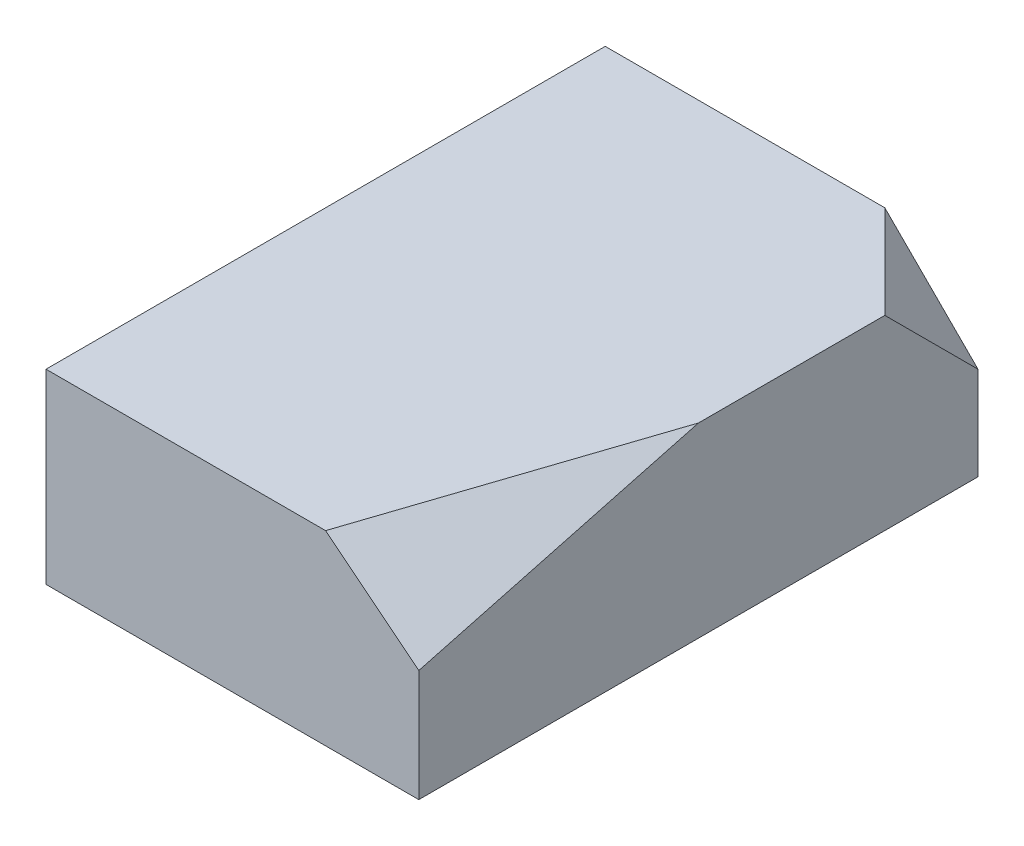
ISO-10303-21;
HEADER;
FILE_DESCRIPTION(('STEP AP214'),'2;1');
FILE_NAME('part.step','',(''),(''),'','','');
FILE_SCHEMA(('AUTOMOTIVE_DESIGN { 1 0 10303 214 1 1 1 1 }'));
ENDSEC;
DATA;
#1=APPLICATION_CONTEXT('core data for automotive mechanical design processes');
#2=APPLICATION_PROTOCOL_DEFINITION('international standard','automotive_design',2000,#1);
#3=PRODUCT_CONTEXT('',#1,'mechanical');
#4=PRODUCT('Part','Part','',(#3));
#5=PRODUCT_RELATED_PRODUCT_CATEGORY('part','',(#4));
#6=PRODUCT_DEFINITION_FORMATION('','',#4);
#7=PRODUCT_DEFINITION_CONTEXT('part definition',#1,'design');
#8=PRODUCT_DEFINITION('design','',#6,#7);
#9=PRODUCT_DEFINITION_SHAPE('','',#8);
#10=(LENGTH_UNIT() NAMED_UNIT(*) SI_UNIT(.MILLI.,.METRE.));
#11=(NAMED_UNIT(*) PLANE_ANGLE_UNIT() SI_UNIT($,.RADIAN.));
#12=(NAMED_UNIT(*) SI_UNIT($,.STERADIAN.) SOLID_ANGLE_UNIT());
#13=UNCERTAINTY_MEASURE_WITH_UNIT(LENGTH_MEASURE(1.E-05),#10,'distance_accuracy_value','');
#14=(GEOMETRIC_REPRESENTATION_CONTEXT(3) GLOBAL_UNCERTAINTY_ASSIGNED_CONTEXT((#13)) GLOBAL_UNIT_ASSIGNED_CONTEXT((#10,
#11,#12)) REPRESENTATION_CONTEXT('',''));
#15=CARTESIAN_POINT('',(0.,0.,0.));
#16=DIRECTION('',(0.,0.,1.));
#17=DIRECTION('',(1.,0.,0.));
#18=AXIS2_PLACEMENT_3D('',#15,#16,#17);
#19=CARTESIAN_POINT('',(50.8,50.8,76.2));
#20=DIRECTION('',(-1.,0.,0.));
#21=DIRECTION('',(0.,0.,1.));
#22=AXIS2_PLACEMENT_3D('',#19,#20,#21);
#23=PLANE('',#22);
#24=DIRECTION('',(0.,0.707106781186547,0.707106781186548));
#25=VECTOR('',#24,1.);
#26=CARTESIAN_POINT('',(50.8,50.8,-50.8));
#27=LINE('',#26,#25);
#28=CARTESIAN_POINT('',(50.7999999999999,25.4,-76.2));
#29=VERTEX_POINT('',#28);
#30=CARTESIAN_POINT('',(50.8,50.8,-50.8));
#31=VERTEX_POINT('',#30);
#32=EDGE_CURVE('E54',#29,#31,#27,.T.);
#33=ORIENTED_EDGE('',*,*,#32,.T.);
#34=DIRECTION('',(0.,0.,-1.));
#35=VECTOR('',#34,1.);
#36=CARTESIAN_POINT('',(50.8,50.8,76.2));
#37=LINE('',#36,#35);
#38=CARTESIAN_POINT('',(50.8,50.8,-1.45716771982052E-13));
#39=VERTEX_POINT('',#38);
#40=EDGE_CURVE('E103',#39,#31,#37,.T.);
#41=ORIENTED_EDGE('',*,*,#40,.F.);
#42=DIRECTION('',(0.,0.257662650560332,-0.966234939601246));
#43=VECTOR('',#42,1.);
#44=CARTESIAN_POINT('',(50.7999999999999,50.8,0.));
#45=LINE('',#44,#43);
#46=CARTESIAN_POINT('',(50.7999999999999,30.48,76.2));
#47=VERTEX_POINT('',#46);
#48=EDGE_CURVE('E62',#47,#39,#45,.T.);
#49=ORIENTED_EDGE('',*,*,#48,.F.);
#50=DIRECTION('',(0.,-1.,0.));
#51=VECTOR('',#50,1.);
#52=CARTESIAN_POINT('',(50.8,50.8,76.2));
#53=LINE('',#52,#51);
#54=CARTESIAN_POINT('',(50.8,0.,76.2));
#55=VERTEX_POINT('',#54);
#56=EDGE_CURVE('E123',#47,#55,#53,.T.);
#57=ORIENTED_EDGE('',*,*,#56,.T.);
#58=DIRECTION('',(0.,0.,-1.));
#59=VECTOR('',#58,1.);
#60=CARTESIAN_POINT('',(50.8,0.,76.2));
#61=LINE('',#60,#59);
#62=CARTESIAN_POINT('',(50.8,0.,-76.2));
#63=VERTEX_POINT('',#62);
#64=EDGE_CURVE('E124',#55,#63,#61,.T.);
#65=ORIENTED_EDGE('',*,*,#64,.T.);
#66=DIRECTION('',(0.,-1.,0.));
#67=VECTOR('',#66,1.);
#68=CARTESIAN_POINT('',(50.8,50.8,-76.2));
#69=LINE('',#68,#67);
#70=EDGE_CURVE('E11',#29,#63,#69,.T.);
#71=ORIENTED_EDGE('',*,*,#70,.F.);
#72=EDGE_LOOP('',(#33,#41,#49,#57,#65,#71));
#73=FACE_BOUND('',#72,.T.);
#74=ADVANCED_FACE('F39',(#73),#23,.F.);
#75=CARTESIAN_POINT('',(0.,50.8,0.));
#76=DIRECTION('',(0.,-1.,0.));
#77=DIRECTION('',(0.,0.,-1.));
#78=AXIS2_PLACEMENT_3D('',#75,#76,#77);
#79=PLANE('',#78);
#80=DIRECTION('',(-0.707106781186548,0.,-0.707106781186547));
#81=VECTOR('',#80,1.);
#82=CARTESIAN_POINT('',(25.3999999999999,50.8,-76.2));
#83=LINE('',#82,#81);
#84=CARTESIAN_POINT('',(25.3999999999999,50.8,-76.2));
#85=VERTEX_POINT('',#84);
#86=EDGE_CURVE('E91',#31,#85,#83,.T.);
#87=ORIENTED_EDGE('',*,*,#86,.T.);
#88=DIRECTION('',(-1.,0.,0.));
#89=VECTOR('',#88,1.);
#90=CARTESIAN_POINT('',(-50.8,50.8,-76.2));
#91=LINE('',#90,#89);
#92=CARTESIAN_POINT('',(-50.8,50.8,-76.2));
#93=VERTEX_POINT('',#92);
#94=EDGE_CURVE('E100',#85,#93,#91,.T.);
#95=ORIENTED_EDGE('',*,*,#94,.T.);
#96=DIRECTION('',(0.,0.,1.));
#97=VECTOR('',#96,1.);
#98=CARTESIAN_POINT('',(-50.8,50.8,76.2));
#99=LINE('',#98,#97);
#100=CARTESIAN_POINT('',(-50.8,50.8,76.2));
#101=VERTEX_POINT('',#100);
#102=EDGE_CURVE('E110',#93,#101,#99,.T.);
#103=ORIENTED_EDGE('',*,*,#102,.T.);
#104=DIRECTION('',(1.,0.,0.));
#105=VECTOR('',#104,1.);
#106=CARTESIAN_POINT('',(-50.8,50.8,76.2));
#107=LINE('',#106,#105);
#108=CARTESIAN_POINT('',(25.4,50.8,76.2));
#109=VERTEX_POINT('',#108);
#110=EDGE_CURVE('E114',#101,#109,#107,.T.);
#111=ORIENTED_EDGE('',*,*,#110,.T.);
#112=DIRECTION('',(-0.316227766016838,0.,0.948683298050514));
#113=VECTOR('',#112,1.);
#114=CARTESIAN_POINT('',(25.4,50.8,76.2));
#115=LINE('',#114,#113);
#116=EDGE_CURVE('E129',#39,#109,#115,.T.);
#117=ORIENTED_EDGE('',*,*,#116,.F.);
#118=ORIENTED_EDGE('',*,*,#40,.T.);
#119=EDGE_LOOP('',(#87,#95,#103,#111,#117,#118));
#120=FACE_BOUND('',#119,.T.);
#121=ADVANCED_FACE('F99',(#120),#79,.F.);
#122=CARTESIAN_POINT('',(-50.8,50.8,-76.2));
#123=DIRECTION('',(0.,0.,1.));
#124=DIRECTION('',(1.,0.,0.));
#125=AXIS2_PLACEMENT_3D('',#122,#123,#124);
#126=PLANE('',#125);
#127=DIRECTION('',(0.707106781186548,-0.707106781186547,0.));
#128=VECTOR('',#127,1.);
#129=CARTESIAN_POINT('',(50.7999999999999,25.4,-76.2));
#130=LINE('',#129,#128);
#131=EDGE_CURVE('E88',#85,#29,#130,.T.);
#132=ORIENTED_EDGE('',*,*,#131,.T.);
#133=ORIENTED_EDGE('',*,*,#70,.T.);
#134=DIRECTION('',(-1.,0.,0.));
#135=VECTOR('',#134,1.);
#136=CARTESIAN_POINT('',(-50.8,0.,-76.2));
#137=LINE('',#136,#135);
#138=CARTESIAN_POINT('',(-50.8,0.,-76.2));
#139=VERTEX_POINT('',#138);
#140=EDGE_CURVE('E128',#63,#139,#137,.T.);
#141=ORIENTED_EDGE('',*,*,#140,.T.);
#142=DIRECTION('',(0.,-1.,0.));
#143=VECTOR('',#142,1.);
#144=CARTESIAN_POINT('',(-50.8,50.8,-76.2));
#145=LINE('',#144,#143);
#146=EDGE_CURVE('E47',#93,#139,#145,.T.);
#147=ORIENTED_EDGE('',*,*,#146,.F.);
#148=ORIENTED_EDGE('',*,*,#94,.F.);
#149=EDGE_LOOP('',(#132,#133,#141,#147,#148));
#150=FACE_BOUND('',#149,.T.);
#151=ADVANCED_FACE('F106',(#150),#126,.F.);
#152=CARTESIAN_POINT('',(-50.8,50.8,76.2));
#153=DIRECTION('',(0.,0.,-1.));
#154=DIRECTION('',(-1.,0.,0.));
#155=AXIS2_PLACEMENT_3D('',#152,#153,#154);
#156=PLANE('',#155);
#157=DIRECTION('',(0.78086880944303,-0.624695047554425,0.));
#158=VECTOR('',#157,1.);
#159=CARTESIAN_POINT('',(50.7999999999999,30.48,76.2));
#160=LINE('',#159,#158);
#161=EDGE_CURVE('E158',#109,#47,#160,.T.);
#162=ORIENTED_EDGE('',*,*,#161,.F.);
#163=ORIENTED_EDGE('',*,*,#110,.F.);
#164=DIRECTION('',(0.,-1.,0.));
#165=VECTOR('',#164,1.);
#166=CARTESIAN_POINT('',(-50.8,50.8,76.2));
#167=LINE('',#166,#165);
#168=CARTESIAN_POINT('',(-50.8,0.,76.2));
#169=VERTEX_POINT('',#168);
#170=EDGE_CURVE('E140',#101,#169,#167,.T.);
#171=ORIENTED_EDGE('',*,*,#170,.T.);
#172=DIRECTION('',(1.,0.,0.));
#173=VECTOR('',#172,1.);
#174=CARTESIAN_POINT('',(-50.8,0.,76.2));
#175=LINE('',#174,#173);
#176=EDGE_CURVE('E116',#169,#55,#175,.T.);
#177=ORIENTED_EDGE('',*,*,#176,.T.);
#178=ORIENTED_EDGE('',*,*,#56,.F.);
#179=EDGE_LOOP('',(#162,#163,#171,#177,#178));
#180=FACE_BOUND('',#179,.T.);
#181=ADVANCED_FACE('F156',(#180),#156,.F.);
#182=CARTESIAN_POINT('',(-50.8,50.8,76.2));
#183=DIRECTION('',(1.,0.,0.));
#184=DIRECTION('',(0.,0.,-1.));
#185=AXIS2_PLACEMENT_3D('',#182,#183,#184);
#186=PLANE('',#185);
#187=DIRECTION('',(0.,0.,1.));
#188=VECTOR('',#187,1.);
#189=CARTESIAN_POINT('',(-50.8,0.,76.2));
#190=LINE('',#189,#188);
#191=EDGE_CURVE('E132',#139,#169,#190,.T.);
#192=ORIENTED_EDGE('',*,*,#191,.T.);
#193=ORIENTED_EDGE('',*,*,#170,.F.);
#194=ORIENTED_EDGE('',*,*,#102,.F.);
#195=ORIENTED_EDGE('',*,*,#146,.T.);
#196=EDGE_LOOP('',(#192,#193,#194,#195));
#197=FACE_BOUND('',#196,.T.);
#198=ADVANCED_FACE('F146',(#197),#186,.F.);
#199=CARTESIAN_POINT('',(0.,0.,0.));
#200=DIRECTION('',(0.,-1.,0.));
#201=DIRECTION('',(0.,0.,-1.));
#202=AXIS2_PLACEMENT_3D('',#199,#200,#201);
#203=PLANE('',#202);
#204=ORIENTED_EDGE('',*,*,#64,.F.);
#205=ORIENTED_EDGE('',*,*,#176,.F.);
#206=ORIENTED_EDGE('',*,*,#191,.F.);
#207=ORIENTED_EDGE('',*,*,#140,.F.);
#208=EDGE_LOOP('',(#204,#205,#206,#207));
#209=FACE_BOUND('',#208,.T.);
#210=ADVANCED_FACE('F152',(#209),#203,.T.);
#211=CARTESIAN_POINT('',(42.7511688311688,53.438961038961,14.2503896103896));
#212=DIRECTION('',(0.611576629725151,0.764470787156438,0.20385887657505));
#213=DIRECTION('',(-0.78086880944303,0.624695047554425,0.));
#214=AXIS2_PLACEMENT_3D('',#211,#212,#213);
#215=PLANE('',#214);
#216=ORIENTED_EDGE('',*,*,#161,.T.);
#217=ORIENTED_EDGE('',*,*,#48,.T.);
#218=ORIENTED_EDGE('',*,*,#116,.T.);
#219=EDGE_LOOP('',(#216,#217,#218));
#220=FACE_BOUND('',#219,.T.);
#221=ADVANCED_FACE('F167',(#220),#215,.T.);
#222=CARTESIAN_POINT('',(50.8,50.8,-50.8));
#223=DIRECTION('',(0.577350269189626,0.577350269189626,-0.577350269189626));
#224=DIRECTION('',(-0.707106781186548,0.,-0.707106781186547));
#225=AXIS2_PLACEMENT_3D('',#222,#223,#224);
#226=PLANE('',#225);
#227=ORIENTED_EDGE('',*,*,#86,.F.);
#228=ORIENTED_EDGE('',*,*,#32,.F.);
#229=ORIENTED_EDGE('',*,*,#131,.F.);
#230=EDGE_LOOP('',(#227,#228,#229));
#231=FACE_BOUND('',#230,.T.);
#232=ADVANCED_FACE('F90',(#231),#226,.T.);
#233=CLOSED_SHELL('',(#74,#121,#151,#181,#198,#210,#221,#232));
#234=MANIFOLD_SOLID_BREP('B2',#233);
#235=ADVANCED_BREP_SHAPE_REPRESENTATION('',(#18,#234),#14);
#236=SHAPE_DEFINITION_REPRESENTATION(#9,#235);
ENDSEC;
END-ISO-10303-21;
